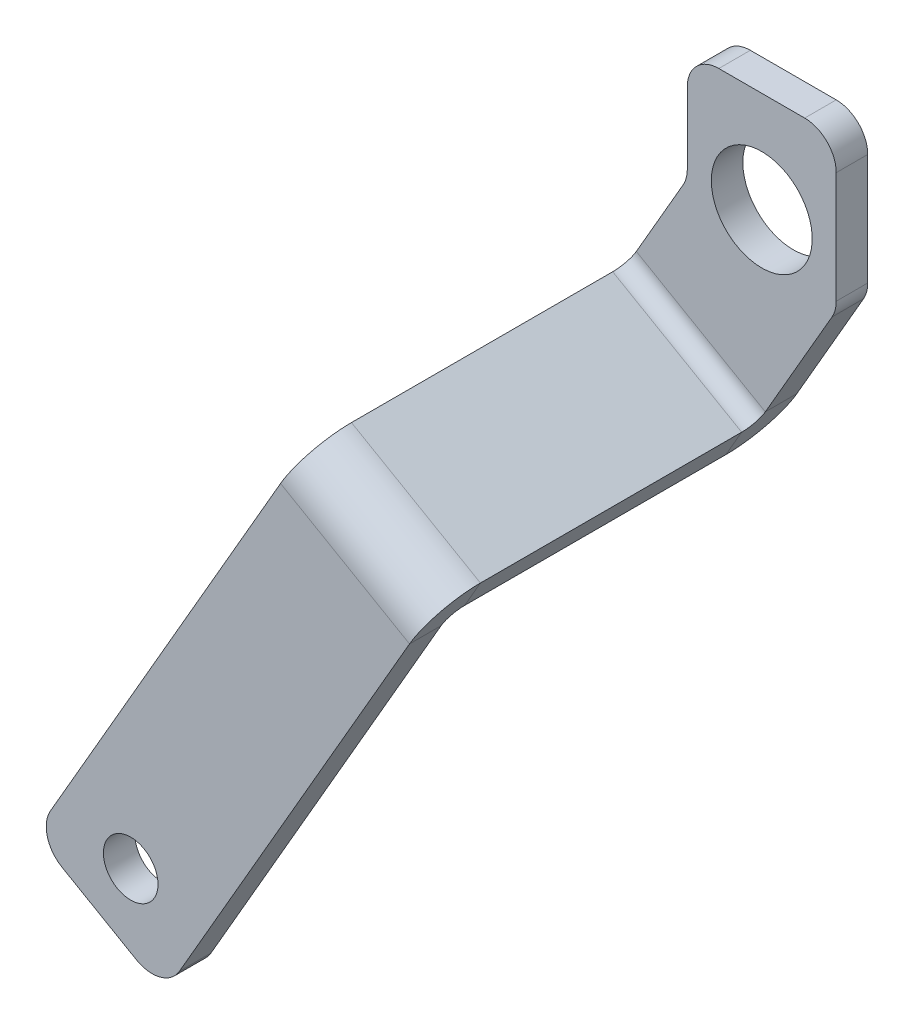
ISO-10303-21;
HEADER;
FILE_DESCRIPTION(('STEP AP214'),'2;1');
FILE_NAME('part.step','',(''),(''),'','','');
FILE_SCHEMA(('AUTOMOTIVE_DESIGN { 1 0 10303 214 1 1 1 1 }'));
ENDSEC;
DATA;
#1=APPLICATION_CONTEXT('core data for automotive mechanical design processes');
#2=APPLICATION_PROTOCOL_DEFINITION('international standard','automotive_design',2000,#1);
#3=PRODUCT_CONTEXT('',#1,'mechanical');
#4=PRODUCT('Part','Part','',(#3));
#5=PRODUCT_RELATED_PRODUCT_CATEGORY('part','',(#4));
#6=PRODUCT_DEFINITION_FORMATION('','',#4);
#7=PRODUCT_DEFINITION_CONTEXT('part definition',#1,'design');
#8=PRODUCT_DEFINITION('design','',#6,#7);
#9=PRODUCT_DEFINITION_SHAPE('','',#8);
#10=(LENGTH_UNIT() NAMED_UNIT(*) SI_UNIT(.MILLI.,.METRE.));
#11=(NAMED_UNIT(*) PLANE_ANGLE_UNIT() SI_UNIT($,.RADIAN.));
#12=(NAMED_UNIT(*) SI_UNIT($,.STERADIAN.) SOLID_ANGLE_UNIT());
#13=UNCERTAINTY_MEASURE_WITH_UNIT(LENGTH_MEASURE(1.E-05),#10,'distance_accuracy_value','');
#14=(GEOMETRIC_REPRESENTATION_CONTEXT(3) GLOBAL_UNCERTAINTY_ASSIGNED_CONTEXT((#13)) GLOBAL_UNIT_ASSIGNED_CONTEXT((#10,
#11,#12)) REPRESENTATION_CONTEXT('',''));
#15=CARTESIAN_POINT('',(0.,0.,0.));
#16=DIRECTION('',(0.,0.,1.));
#17=DIRECTION('',(1.,0.,0.));
#18=AXIS2_PLACEMENT_3D('',#15,#16,#17);
#19=CARTESIAN_POINT('',(-153.02745566794,29.1285594079911,3.175));
#20=DIRECTION('',(0.86602540378444,-0.499999999999997,0.));
#21=DIRECTION('',(0.499999999999997,0.86602540378444,0.));
#22=AXIS2_PLACEMENT_3D('',#19,#20,#21);
#23=PLANE('',#22);
#24=DIRECTION('',(-0.499999999999997,-0.86602540378444,0.));
#25=VECTOR('',#24,1.);
#26=CARTESIAN_POINT('',(-153.02745566794,29.1285594079911,0.));
#27=LINE('',#26,#25);
#28=CARTESIAN_POINT('',(-128.26245566794,72.0227976574344,0.));
#29=VERTEX_POINT('',#28);
#30=CARTESIAN_POINT('',(-151.43995566794,31.8781900650067,0.));
#31=VERTEX_POINT('',#30);
#32=EDGE_CURVE('E316',#29,#31,#27,.T.);
#33=ORIENTED_EDGE('',*,*,#32,.T.);
#34=DIRECTION('',(0.,0.,-1.));
#35=VECTOR('',#34,1.);
#36=CARTESIAN_POINT('',(-151.43995566794,31.8781900650067,3.175));
#37=LINE('',#36,#35);
#38=CARTESIAN_POINT('',(-151.43995566794,31.8781900650067,3.175));
#39=VERTEX_POINT('',#38);
#40=EDGE_CURVE('E110',#31,#39,#37,.F.);
#41=ORIENTED_EDGE('',*,*,#40,.T.);
#42=DIRECTION('',(-0.499999999999997,-0.86602540378444,0.));
#43=VECTOR('',#42,1.);
#44=CARTESIAN_POINT('',(-128.26245566794,72.0227976574345,3.175));
#45=LINE('',#44,#43);
#46=CARTESIAN_POINT('',(-128.26245566794,72.0227976574345,3.175));
#47=VERTEX_POINT('',#46);
#48=EDGE_CURVE('E325',#47,#39,#45,.T.);
#49=ORIENTED_EDGE('',*,*,#48,.F.);
#50=DIRECTION('',(0.,0.,-1.));
#51=VECTOR('',#50,1.);
#52=CARTESIAN_POINT('',(-128.26245566794,72.0227976574345,3.175));
#53=LINE('',#52,#51);
#54=EDGE_CURVE('E335',#47,#29,#53,.T.);
#55=ORIENTED_EDGE('',*,*,#54,.T.);
#56=EDGE_LOOP('',(#33,#41,#49,#55));
#57=FACE_BOUND('',#56,.T.);
#58=ADVANCED_FACE('F87',(#57),#23,.F.);
#59=CARTESIAN_POINT('',(-140.037074611173,21.6285594079912,3.175));
#60=DIRECTION('',(0.499999999999997,0.86602540378444,0.));
#61=DIRECTION('',(-0.86602540378444,0.499999999999997,0.));
#62=AXIS2_PLACEMENT_3D('',#59,#60,#61);
#63=PLANE('',#62);
#64=DIRECTION('',(0.86602540378444,-0.499999999999997,0.));
#65=VECTOR('',#64,1.);
#66=CARTESIAN_POINT('',(-140.037074611173,21.6285594079912,3.175));
#67=LINE('',#66,#65);
#68=CARTESIAN_POINT('',(-150.277825010924,27.5410594079911,3.175));
#69=VERTEX_POINT('',#68);
#70=CARTESIAN_POINT('',(-142.786705268189,23.2160594079912,3.175));
#71=VERTEX_POINT('',#70);
#72=EDGE_CURVE('E327',#69,#71,#67,.T.);
#73=ORIENTED_EDGE('',*,*,#72,.F.);
#74=DIRECTION('',(0.,0.,-1.));
#75=VECTOR('',#74,1.);
#76=CARTESIAN_POINT('',(-150.277825010924,27.5410594079911,3.175));
#77=LINE('',#76,#75);
#78=CARTESIAN_POINT('',(-150.277825010924,27.5410594079911,0.));
#79=VERTEX_POINT('',#78);
#80=EDGE_CURVE('E385',#69,#79,#77,.T.);
#81=ORIENTED_EDGE('',*,*,#80,.T.);
#82=DIRECTION('',(0.86602540378444,-0.499999999999997,0.));
#83=VECTOR('',#82,1.);
#84=CARTESIAN_POINT('',(-140.037074611173,21.6285594079912,0.));
#85=LINE('',#84,#83);
#86=CARTESIAN_POINT('',(-142.786705268189,23.2160594079912,0.));
#87=VERTEX_POINT('',#86);
#88=EDGE_CURVE('E337',#79,#87,#85,.T.);
#89=ORIENTED_EDGE('',*,*,#88,.T.);
#90=DIRECTION('',(0.,0.,-1.));
#91=VECTOR('',#90,1.);
#92=CARTESIAN_POINT('',(-142.786705268189,23.2160594079912,3.175));
#93=LINE('',#92,#91);
#94=EDGE_CURVE('E383',#87,#71,#93,.F.);
#95=ORIENTED_EDGE('',*,*,#94,.T.);
#96=EDGE_LOOP('',(#73,#81,#89,#95));
#97=FACE_BOUND('',#96,.T.);
#98=ADVANCED_FACE('F453',(#97),#63,.F.);
#99=CARTESIAN_POINT('',(-136.862074611173,27.1278207220224,3.175));
#100=DIRECTION('',(-0.86602540378444,0.499999999999997,0.));
#101=DIRECTION('',(-0.499999999999997,-0.86602540378444,0.));
#102=AXIS2_PLACEMENT_3D('',#99,#100,#101);
#103=PLANE('',#102);
#104=DIRECTION('',(0.499999999999997,0.86602540378444,0.));
#105=VECTOR('',#104,1.);
#106=CARTESIAN_POINT('',(-136.862074611173,27.1278207220224,3.175));
#107=LINE('',#106,#105);
#108=CARTESIAN_POINT('',(-138.449574611173,24.3781900650068,3.175));
#109=VERTEX_POINT('',#108);
#110=CARTESIAN_POINT('',(-115.272074611173,64.5227976574345,3.17500000000002));
#111=VERTEX_POINT('',#110);
#112=EDGE_CURVE('E330',#109,#111,#107,.T.);
#113=ORIENTED_EDGE('',*,*,#112,.F.);
#114=DIRECTION('',(0.,0.,-1.));
#115=VECTOR('',#114,1.);
#116=CARTESIAN_POINT('',(-138.449574611173,24.3781900650068,3.175));
#117=LINE('',#116,#115);
#118=CARTESIAN_POINT('',(-138.449574611173,24.3781900650068,0.));
#119=VERTEX_POINT('',#118);
#120=EDGE_CURVE('E396',#109,#119,#117,.T.);
#121=ORIENTED_EDGE('',*,*,#120,.T.);
#122=DIRECTION('',(0.499999999999997,0.86602540378444,0.));
#123=VECTOR('',#122,1.);
#124=CARTESIAN_POINT('',(-136.862074611173,27.1278207220224,0.));
#125=LINE('',#124,#123);
#126=CARTESIAN_POINT('',(-115.272074611173,64.5227976574345,0.));
#127=VERTEX_POINT('',#126);
#128=EDGE_CURVE('E340',#119,#127,#125,.T.);
#129=ORIENTED_EDGE('',*,*,#128,.T.);
#130=DIRECTION('',(0.,0.,-1.));
#131=VECTOR('',#130,1.);
#132=CARTESIAN_POINT('',(-115.272074611173,64.5227976574345,3.175));
#133=LINE('',#132,#131);
#134=EDGE_CURVE('E345',#111,#127,#133,.T.);
#135=ORIENTED_EDGE('',*,*,#134,.F.);
#136=EDGE_LOOP('',(#113,#121,#129,#135));
#137=FACE_BOUND('',#136,.T.);
#138=ADVANCED_FACE('F459',(#137),#103,.F.);
#139=CARTESIAN_POINT('',(0.,0.,3.175));
#140=DIRECTION('',(0.,0.,-1.));
#141=DIRECTION('',(-1.,0.,0.));
#142=AXIS2_PLACEMENT_3D('',#139,#140,#141);
#143=PLANE('',#142);
#144=CARTESIAN_POINT('',(-143.357265139557,30.8778207220224,3.175));
#145=DIRECTION('',(0.,0.,1.));
#146=DIRECTION('',(1.,0.,0.));
#147=AXIS2_PLACEMENT_3D('',#144,#145,#146);
#148=CIRCLE('',#147,2.75);
#149=CARTESIAN_POINT('',(-140.607265139557,30.8778207220224,3.175));
#150=VERTEX_POINT('',#149);
#151=EDGE_CURVE('E353',#150,#150,#148,.T.);
#152=ORIENTED_EDGE('',*,*,#151,.F.);
#153=EDGE_LOOP('',(#152));
#154=FACE_BOUND('',#153,.T.);
#155=ORIENTED_EDGE('',*,*,#48,.T.);
#156=CARTESIAN_POINT('',(-148.690325010924,30.2906900650067,3.175));
#157=DIRECTION('',(0.,0.,-1.));
#158=DIRECTION('',(-1.,0.,0.));
#159=AXIS2_PLACEMENT_3D('',#156,#157,#158);
#160=CIRCLE('',#159,3.175);
#161=EDGE_CURVE('E394',#39,#69,#160,.F.);
#162=ORIENTED_EDGE('',*,*,#161,.T.);
#163=ORIENTED_EDGE('',*,*,#72,.T.);
#164=CARTESIAN_POINT('',(-141.199205268189,25.9656900650068,3.175));
#165=DIRECTION('',(0.,0.,-1.));
#166=DIRECTION('',(-1.,0.,0.));
#167=AXIS2_PLACEMENT_3D('',#164,#165,#166);
#168=CIRCLE('',#167,3.175);
#169=EDGE_CURVE('E102',#71,#109,#168,.F.);
#170=ORIENTED_EDGE('',*,*,#169,.T.);
#171=ORIENTED_EDGE('',*,*,#112,.T.);
#172=DIRECTION('',(-0.86602540378444,0.499999999999997,0.));
#173=VECTOR('',#172,1.);
#174=CARTESIAN_POINT('',(-115.272074611173,64.5227976574345,3.175));
#175=LINE('',#174,#173);
#176=EDGE_CURVE('E332',#111,#47,#175,.T.);
#177=ORIENTED_EDGE('',*,*,#176,.T.);
#178=EDGE_LOOP('',(#155,#162,#163,#170,#171,#177));
#179=FACE_BOUND('',#178,.T.);
#180=ADVANCED_FACE('F520',(#154,#179),#143,.F.);
#181=CARTESIAN_POINT('',(0.,0.,0.));
#182=DIRECTION('',(0.,0.,-1.));
#183=DIRECTION('',(-1.,0.,0.));
#184=AXIS2_PLACEMENT_3D('',#181,#182,#183);
#185=PLANE('',#184);
#186=CARTESIAN_POINT('',(-143.357265139557,30.8778207220224,0.));
#187=DIRECTION('',(0.,0.,-1.));
#188=DIRECTION('',(-1.,0.,0.));
#189=AXIS2_PLACEMENT_3D('',#186,#187,#188);
#190=CIRCLE('',#189,2.75);
#191=CARTESIAN_POINT('',(-146.107265139557,30.8778207220224,0.));
#192=VERTEX_POINT('',#191);
#193=EDGE_CURVE('E349',#192,#192,#190,.T.);
#194=ORIENTED_EDGE('',*,*,#193,.F.);
#195=EDGE_LOOP('',(#194));
#196=FACE_BOUND('',#195,.T.);
#197=ORIENTED_EDGE('',*,*,#88,.F.);
#198=CARTESIAN_POINT('',(-148.690325010924,30.2906900650067,0.));
#199=DIRECTION('',(0.,0.,-1.));
#200=DIRECTION('',(-1.,0.,0.));
#201=AXIS2_PLACEMENT_3D('',#198,#199,#200);
#202=CIRCLE('',#201,3.175);
#203=EDGE_CURVE('E390',#79,#31,#202,.T.);
#204=ORIENTED_EDGE('',*,*,#203,.T.);
#205=ORIENTED_EDGE('',*,*,#32,.F.);
#206=DIRECTION('',(-0.86602540378444,0.499999999999997,0.));
#207=VECTOR('',#206,1.);
#208=CARTESIAN_POINT('',(-115.272074611173,64.5227976574345,0.));
#209=LINE('',#208,#207);
#210=EDGE_CURVE('E328',#127,#29,#209,.T.);
#211=ORIENTED_EDGE('',*,*,#210,.F.);
#212=ORIENTED_EDGE('',*,*,#128,.F.);
#213=CARTESIAN_POINT('',(-141.199205268189,25.9656900650068,0.));
#214=DIRECTION('',(0.,0.,-1.));
#215=DIRECTION('',(-1.,0.,0.));
#216=AXIS2_PLACEMENT_3D('',#213,#214,#215);
#217=CIRCLE('',#216,3.175);
#218=EDGE_CURVE('E388',#119,#87,#217,.T.);
#219=ORIENTED_EDGE('',*,*,#218,.T.);
#220=EDGE_LOOP('',(#197,#204,#205,#211,#212,#219));
#221=FACE_BOUND('',#220,.T.);
#222=ADVANCED_FACE('F532',(#196,#221),#185,.T.);
#223=CARTESIAN_POINT('',(-128.26245566794,72.0227976574344,-1.5875));
#224=DIRECTION('',(-0.866025403784441,0.499999999999996,0.));
#225=DIRECTION('',(-0.499999999999996,-0.866025403784441,0.));
#226=AXIS2_PLACEMENT_3D('',#223,#224,#225);
#227=PLANE('',#226);
#228=DIRECTION('',(-0.499999999999997,-0.86602540378444,0.));
#229=VECTOR('',#228,1.);
#230=CARTESIAN_POINT('',(-125.88120566794,76.1472436429578,-1.58749999999998));
#231=LINE('',#230,#229);
#232=CARTESIAN_POINT('',(-127.46870566794,73.3976129859422,-1.58749999999999));
#233=VERTEX_POINT('',#232);
#234=CARTESIAN_POINT('',(-125.88120566794,76.1472436429578,-1.58749999999998));
#235=VERTEX_POINT('',#234);
#236=EDGE_CURVE('E279',#233,#235,#231,.F.);
#237=ORIENTED_EDGE('',*,*,#236,.F.);
#238=CARTESIAN_POINT('',(-128.26245566794,72.0227976574344,-1.5875));
#239=DIRECTION('',(0.866025403784441,-0.499999999999996,0.));
#240=DIRECTION('',(0.499999999999996,0.866025403784441,0.));
#241=AXIS2_PLACEMENT_3D('',#238,#239,#240);
#242=CIRCLE('',#241,1.58750000000003);
#243=EDGE_CURVE('E320',#29,#233,#242,.F.);
#244=ORIENTED_EDGE('',*,*,#243,.F.);
#245=ORIENTED_EDGE('',*,*,#54,.F.);
#246=CARTESIAN_POINT('',(-128.26245566794,72.0227976574344,-1.5875));
#247=DIRECTION('',(0.866025403784441,-0.499999999999996,0.));
#248=DIRECTION('',(0.499999999999996,0.866025403784441,0.));
#249=AXIS2_PLACEMENT_3D('',#246,#247,#248);
#250=CIRCLE('',#249,4.76250000000003);
#251=EDGE_CURVE('E313',#47,#235,#250,.F.);
#252=ORIENTED_EDGE('',*,*,#251,.T.);
#253=EDGE_LOOP('',(#237,#244,#245,#252));
#254=FACE_BOUND('',#253,.T.);
#255=ADVANCED_FACE('F500',(#254),#227,.T.);
#256=CARTESIAN_POINT('',(-115.272074611173,64.5227976574345,-1.5875));
#257=DIRECTION('',(-0.866025403784441,0.499999999999996,0.));
#258=DIRECTION('',(-0.499999999999996,-0.866025403784441,0.));
#259=AXIS2_PLACEMENT_3D('',#256,#257,#258);
#260=PLANE('',#259);
#261=CARTESIAN_POINT('',(-115.272074611173,64.5227976574345,-1.5875));
#262=DIRECTION('',(0.866025403784441,-0.499999999999996,0.));
#263=DIRECTION('',(0.499999999999996,0.866025403784441,0.));
#264=AXIS2_PLACEMENT_3D('',#261,#262,#263);
#265=CIRCLE('',#264,1.58750000000003);
#266=CARTESIAN_POINT('',(-114.478324611173,65.8976129859423,-1.5875));
#267=VERTEX_POINT('',#266);
#268=EDGE_CURVE('E287',#267,#127,#265,.T.);
#269=ORIENTED_EDGE('',*,*,#268,.F.);
#270=DIRECTION('',(-0.499999999999997,-0.86602540378444,0.));
#271=VECTOR('',#270,1.);
#272=CARTESIAN_POINT('',(-114.478324611173,65.8976129859423,-1.5875));
#273=LINE('',#272,#271);
#274=CARTESIAN_POINT('',(-112.890824611173,68.6472436429579,-1.58749999999999));
#275=VERTEX_POINT('',#274);
#276=EDGE_CURVE('E306',#267,#275,#273,.F.);
#277=ORIENTED_EDGE('',*,*,#276,.T.);
#278=CARTESIAN_POINT('',(-115.272074611173,64.5227976574345,-1.5875));
#279=DIRECTION('',(0.866025403784441,-0.499999999999996,0.));
#280=DIRECTION('',(0.499999999999996,0.866025403784441,0.));
#281=AXIS2_PLACEMENT_3D('',#278,#279,#280);
#282=CIRCLE('',#281,4.76250000000003);
#283=EDGE_CURVE('E317',#275,#111,#282,.T.);
#284=ORIENTED_EDGE('',*,*,#283,.T.);
#285=ORIENTED_EDGE('',*,*,#134,.T.);
#286=EDGE_LOOP('',(#269,#277,#284,#285));
#287=FACE_BOUND('',#286,.T.);
#288=ADVANCED_FACE('F515',(#287),#260,.F.);
#289=CARTESIAN_POINT('',(-115.272074611173,64.5227976574345,-1.5875));
#290=DIRECTION('',(0.866025403784441,-0.499999999999996,0.));
#291=DIRECTION('',(0.499999999999996,0.866025403784441,0.));
#292=AXIS2_PLACEMENT_3D('',#289,#290,#291);
#293=CYLINDRICAL_SURFACE('',#292,4.76250000000003);
#294=ORIENTED_EDGE('',*,*,#176,.F.);
#295=ORIENTED_EDGE('',*,*,#283,.F.);
#296=DIRECTION('',(0.86602540378444,-0.499999999999997,0.));
#297=VECTOR('',#296,1.);
#298=CARTESIAN_POINT('',(-125.88120566794,76.1472436429576,-1.58749999999998));
#299=LINE('',#298,#297);
#300=EDGE_CURVE('E304',#275,#235,#299,.F.);
#301=ORIENTED_EDGE('',*,*,#300,.T.);
#302=ORIENTED_EDGE('',*,*,#251,.F.);
#303=EDGE_LOOP('',(#294,#295,#301,#302));
#304=FACE_BOUND('',#303,.T.);
#305=ADVANCED_FACE('F519',(#304),#293,.T.);
#306=CARTESIAN_POINT('',(-115.272074611173,64.5227976574345,-1.5875));
#307=DIRECTION('',(0.866025403784441,-0.499999999999996,0.));
#308=DIRECTION('',(0.499999999999996,0.866025403784441,0.));
#309=AXIS2_PLACEMENT_3D('',#306,#307,#308);
#310=CYLINDRICAL_SURFACE('',#309,1.58750000000003);
#311=ORIENTED_EDGE('',*,*,#210,.T.);
#312=ORIENTED_EDGE('',*,*,#243,.T.);
#313=DIRECTION('',(0.86602540378444,-0.499999999999997,0.));
#314=VECTOR('',#313,1.);
#315=CARTESIAN_POINT('',(-127.46870566794,73.397612985942,-1.58749999999999));
#316=LINE('',#315,#314);
#317=EDGE_CURVE('E309',#233,#267,#316,.T.);
#318=ORIENTED_EDGE('',*,*,#317,.T.);
#319=ORIENTED_EDGE('',*,*,#268,.T.);
#320=EDGE_LOOP('',(#311,#312,#318,#319));
#321=FACE_BOUND('',#320,.T.);
#322=ADVANCED_FACE('F505',(#321),#310,.F.);
#323=CARTESIAN_POINT('',(-112.890824611173,68.6472436429576,-27.899995));
#324=DIRECTION('',(-0.86602540378444,0.499999999999997,0.));
#325=DIRECTION('',(-0.499999999999997,-0.86602540378444,0.));
#326=AXIS2_PLACEMENT_3D('',#323,#324,#325);
#327=PLANE('',#326);
#328=ORIENTED_EDGE('',*,*,#276,.F.);
#329=DIRECTION('',(0.,0.,1.));
#330=VECTOR('',#329,1.);
#331=CARTESIAN_POINT('',(-114.478324611173,65.897612985942,-27.899995));
#332=LINE('',#331,#330);
#333=CARTESIAN_POINT('',(-114.478324611173,65.897612985942,-27.899995));
#334=VERTEX_POINT('',#333);
#335=EDGE_CURVE('E302',#267,#334,#332,.F.);
#336=ORIENTED_EDGE('',*,*,#335,.T.);
#337=DIRECTION('',(-0.499999999999997,-0.86602540378444,0.));
#338=VECTOR('',#337,1.);
#339=CARTESIAN_POINT('',(-112.890824611173,68.6472436429576,-27.899995));
#340=LINE('',#339,#338);
#341=CARTESIAN_POINT('',(-112.890824611173,68.6472436429576,-27.899995));
#342=VERTEX_POINT('',#341);
#343=EDGE_CURVE('E284',#342,#334,#340,.T.);
#344=ORIENTED_EDGE('',*,*,#343,.F.);
#345=DIRECTION('',(0.,0.,-1.));
#346=VECTOR('',#345,1.);
#347=CARTESIAN_POINT('',(-112.890824611173,68.6472436429579,-3.82332133157478E-12));
#348=LINE('',#347,#346);
#349=EDGE_CURVE('E296',#275,#342,#348,.T.);
#350=ORIENTED_EDGE('',*,*,#349,.F.);
#351=EDGE_LOOP('',(#328,#336,#344,#350));
#352=FACE_BOUND('',#351,.T.);
#353=ADVANCED_FACE('F513',(#352),#327,.F.);
#354=CARTESIAN_POINT('',(-125.88120566794,76.1472436429578,0.));
#355=DIRECTION('',(0.86602540378444,-0.499999999999997,0.));
#356=DIRECTION('',(0.499999999999997,0.86602540378444,0.));
#357=AXIS2_PLACEMENT_3D('',#354,#355,#356);
#358=PLANE('',#357);
#359=ORIENTED_EDGE('',*,*,#236,.T.);
#360=DIRECTION('',(0.,0.,1.));
#361=VECTOR('',#360,1.);
#362=CARTESIAN_POINT('',(-125.88120566794,76.1472436429578,-4.421356006099E-12));
#363=LINE('',#362,#361);
#364=CARTESIAN_POINT('',(-125.881205667939,76.1472436429575,-27.899995));
#365=VERTEX_POINT('',#364);
#366=EDGE_CURVE('E291',#365,#235,#363,.T.);
#367=ORIENTED_EDGE('',*,*,#366,.F.);
#368=DIRECTION('',(-0.499999999999997,-0.86602540378444,0.));
#369=VECTOR('',#368,1.);
#370=CARTESIAN_POINT('',(-125.881205667939,76.1472436429575,-27.899995));
#371=LINE('',#370,#369);
#372=CARTESIAN_POINT('',(-127.468705667939,73.3976129859419,-27.899995));
#373=VERTEX_POINT('',#372);
#374=EDGE_CURVE('E288',#365,#373,#371,.T.);
#375=ORIENTED_EDGE('',*,*,#374,.T.);
#376=DIRECTION('',(0.,0.,-1.));
#377=VECTOR('',#376,1.);
#378=CARTESIAN_POINT('',(-127.46870566794,73.3976129859422,0.));
#379=LINE('',#378,#377);
#380=EDGE_CURVE('E298',#373,#233,#379,.F.);
#381=ORIENTED_EDGE('',*,*,#380,.T.);
#382=EDGE_LOOP('',(#359,#367,#375,#381));
#383=FACE_BOUND('',#382,.T.);
#384=ADVANCED_FACE('F497',(#383),#358,.F.);
#385=CARTESIAN_POINT('',(1.50242229449749,2.60227174849389,0.));
#386=DIRECTION('',(-0.499999999999998,-0.86602540378444,0.));
#387=DIRECTION('',(0.86602540378444,-0.499999999999997,0.));
#388=AXIS2_PLACEMENT_3D('',#385,#386,#387);
#389=PLANE('',#388);
#390=ORIENTED_EDGE('',*,*,#300,.F.);
#391=ORIENTED_EDGE('',*,*,#349,.T.);
#392=DIRECTION('',(-0.86602540378444,0.499999999999997,0.));
#393=VECTOR('',#392,1.);
#394=CARTESIAN_POINT('',(1.50242229449754,2.60227174849397,-27.899995));
#395=LINE('',#394,#393);
#396=EDGE_CURVE('E294',#342,#365,#395,.T.);
#397=ORIENTED_EDGE('',*,*,#396,.T.);
#398=ORIENTED_EDGE('',*,*,#366,.T.);
#399=EDGE_LOOP('',(#390,#391,#397,#398));
#400=FACE_BOUND('',#399,.T.);
#401=ADVANCED_FACE('F493',(#400),#389,.F.);
#402=CARTESIAN_POINT('',(-0.0850777055024985,-0.147358908521709,0.));
#403=DIRECTION('',(-0.499999999999998,-0.86602540378444,0.));
#404=DIRECTION('',(0.86602540378444,-0.499999999999997,0.));
#405=AXIS2_PLACEMENT_3D('',#402,#403,#404);
#406=PLANE('',#405);
#407=ORIENTED_EDGE('',*,*,#335,.F.);
#408=ORIENTED_EDGE('',*,*,#317,.F.);
#409=ORIENTED_EDGE('',*,*,#380,.F.);
#410=DIRECTION('',(0.86602540378444,-0.499999999999997,0.));
#411=VECTOR('',#410,1.);
#412=CARTESIAN_POINT('',(-127.468705667939,73.3976129859419,-27.899995));
#413=LINE('',#412,#411);
#414=EDGE_CURVE('E235',#334,#373,#413,.F.);
#415=ORIENTED_EDGE('',*,*,#414,.F.);
#416=EDGE_LOOP('',(#407,#408,#409,#415));
#417=FACE_BOUND('',#416,.T.);
#418=ADVANCED_FACE('F510',(#417),#406,.T.);
#419=CARTESIAN_POINT('',(-112.097074611173,70.0220589714654,-27.899995));
#420=DIRECTION('',(0.86602540378444,-0.499999999999998,0.));
#421=DIRECTION('',(0.499999999999998,0.86602540378444,0.));
#422=AXIS2_PLACEMENT_3D('',#419,#420,#421);
#423=PLANE('',#422);
#424=DIRECTION('',(0.,0.,1.));
#425=VECTOR('',#424,1.);
#426=CARTESIAN_POINT('',(-112.097074611173,70.0220589714654,-32.662495));
#427=LINE('',#426,#425);
#428=CARTESIAN_POINT('',(-112.097074611173,70.0220589714654,-29.487495));
#429=VERTEX_POINT('',#428);
#430=CARTESIAN_POINT('',(-112.097074611173,70.0220589714654,-32.662495));
#431=VERTEX_POINT('',#430);
#432=EDGE_CURVE('E275',#429,#431,#427,.F.);
#433=ORIENTED_EDGE('',*,*,#432,.F.);
#434=CARTESIAN_POINT('',(-112.097074611173,70.0220589714654,-27.899995));
#435=DIRECTION('',(-0.86602540378444,0.499999999999998,0.));
#436=DIRECTION('',(-0.499999999999998,-0.86602540378444,0.));
#437=AXIS2_PLACEMENT_3D('',#434,#435,#436);
#438=CIRCLE('',#437,1.5875);
#439=EDGE_CURVE('E239',#342,#429,#438,.F.);
#440=ORIENTED_EDGE('',*,*,#439,.F.);
#441=ORIENTED_EDGE('',*,*,#343,.T.);
#442=CARTESIAN_POINT('',(-112.097074611173,70.0220589714654,-27.899995));
#443=DIRECTION('',(-0.86602540378444,0.499999999999998,0.));
#444=DIRECTION('',(-0.499999999999998,-0.86602540378444,0.));
#445=AXIS2_PLACEMENT_3D('',#442,#443,#444);
#446=CIRCLE('',#445,4.7625);
#447=EDGE_CURVE('E238',#334,#431,#446,.F.);
#448=ORIENTED_EDGE('',*,*,#447,.T.);
#449=EDGE_LOOP('',(#433,#440,#441,#448));
#450=FACE_BOUND('',#449,.T.);
#451=ADVANCED_FACE('F486',(#450),#423,.T.);
#452=CARTESIAN_POINT('',(-125.087455667939,77.5220589714653,-27.899995));
#453=DIRECTION('',(0.86602540378444,-0.499999999999998,0.));
#454=DIRECTION('',(0.499999999999998,0.86602540378444,0.));
#455=AXIS2_PLACEMENT_3D('',#452,#453,#454);
#456=PLANE('',#455);
#457=CARTESIAN_POINT('',(-125.087455667939,77.5220589714653,-27.899995));
#458=DIRECTION('',(-0.86602540378444,0.499999999999998,0.));
#459=DIRECTION('',(-0.499999999999998,-0.86602540378444,0.));
#460=AXIS2_PLACEMENT_3D('',#457,#458,#459);
#461=CIRCLE('',#460,1.5875);
#462=CARTESIAN_POINT('',(-125.087455667939,77.5220589714653,-29.487495));
#463=VERTEX_POINT('',#462);
#464=EDGE_CURVE('E246',#463,#365,#461,.T.);
#465=ORIENTED_EDGE('',*,*,#464,.F.);
#466=DIRECTION('',(0.,0.,1.));
#467=VECTOR('',#466,1.);
#468=CARTESIAN_POINT('',(-125.087455667939,77.5220589714653,-29.487495));
#469=LINE('',#468,#467);
#470=CARTESIAN_POINT('',(-125.087455667939,77.5220589714653,-32.662495));
#471=VERTEX_POINT('',#470);
#472=EDGE_CURVE('E243',#463,#471,#469,.F.);
#473=ORIENTED_EDGE('',*,*,#472,.T.);
#474=CARTESIAN_POINT('',(-125.087455667939,77.5220589714653,-27.899995));
#475=DIRECTION('',(-0.86602540378444,0.499999999999998,0.));
#476=DIRECTION('',(-0.499999999999998,-0.86602540378444,0.));
#477=AXIS2_PLACEMENT_3D('',#474,#475,#476);
#478=CIRCLE('',#477,4.7625);
#479=EDGE_CURVE('E227',#471,#373,#478,.T.);
#480=ORIENTED_EDGE('',*,*,#479,.T.);
#481=ORIENTED_EDGE('',*,*,#374,.F.);
#482=EDGE_LOOP('',(#465,#473,#480,#481));
#483=FACE_BOUND('',#482,.T.);
#484=ADVANCED_FACE('F244',(#483),#456,.F.);
#485=CARTESIAN_POINT('',(-125.087455667939,77.5220589714653,-27.899995));
#486=DIRECTION('',(-0.86602540378444,0.499999999999998,0.));
#487=DIRECTION('',(0.,0.,-1.));
#488=AXIS2_PLACEMENT_3D('',#485,#486,#487);
#489=CYLINDRICAL_SURFACE('',#488,4.7625);
#490=ORIENTED_EDGE('',*,*,#414,.T.);
#491=ORIENTED_EDGE('',*,*,#479,.F.);
#492=DIRECTION('',(-0.866025403784442,0.499999999999995,0.));
#493=VECTOR('',#492,1.);
#494=CARTESIAN_POINT('',(-112.097074611173,70.0220589714654,-32.662495));
#495=LINE('',#494,#493);
#496=EDGE_CURVE('E232',#471,#431,#495,.F.);
#497=ORIENTED_EDGE('',*,*,#496,.T.);
#498=ORIENTED_EDGE('',*,*,#447,.F.);
#499=EDGE_LOOP('',(#490,#491,#497,#498));
#500=FACE_BOUND('',#499,.T.);
#501=ADVANCED_FACE('F229',(#500),#489,.T.);
#502=CARTESIAN_POINT('',(-125.087455667939,77.5220589714653,-27.899995));
#503=DIRECTION('',(-0.86602540378444,0.499999999999998,0.));
#504=DIRECTION('',(0.,0.,-1.));
#505=AXIS2_PLACEMENT_3D('',#502,#503,#504);
#506=CYLINDRICAL_SURFACE('',#505,1.5875);
#507=ORIENTED_EDGE('',*,*,#396,.F.);
#508=ORIENTED_EDGE('',*,*,#439,.T.);
#509=DIRECTION('',(-0.866025403784442,0.499999999999995,0.));
#510=VECTOR('',#509,1.);
#511=CARTESIAN_POINT('',(-112.097074611173,70.0220589714654,-29.487495));
#512=LINE('',#511,#510);
#513=EDGE_CURVE('E251',#429,#463,#512,.T.);
#514=ORIENTED_EDGE('',*,*,#513,.T.);
#515=ORIENTED_EDGE('',*,*,#464,.T.);
#516=EDGE_LOOP('',(#507,#508,#514,#515));
#517=FACE_BOUND('',#516,.T.);
#518=ADVANCED_FACE('F489',(#517),#506,.F.);
#519=CARTESIAN_POINT('',(-122.706205667939,81.6465049569887,-32.662495));
#520=DIRECTION('',(0.866025403784441,-0.499999999999996,0.));
#521=DIRECTION('',(0.499999999999996,0.866025403784441,0.));
#522=AXIS2_PLACEMENT_3D('',#519,#520,#521);
#523=PLANE('',#522);
#524=DIRECTION('',(-0.499999999999996,-0.866025403784441,0.));
#525=VECTOR('',#524,1.);
#526=CARTESIAN_POINT('',(-122.706205667939,81.6465049569887,-29.487495));
#527=LINE('',#526,#525);
#528=CARTESIAN_POINT('',(-120.378693954157,85.6778735004711,-29.487495));
#529=VERTEX_POINT('',#528);
#530=EDGE_CURVE('E261',#463,#529,#527,.F.);
#531=ORIENTED_EDGE('',*,*,#530,.T.);
#532=DIRECTION('',(0.,0.,-1.));
#533=VECTOR('',#532,1.);
#534=CARTESIAN_POINT('',(-120.378693954157,85.6778735004711,-32.662495));
#535=LINE('',#534,#533);
#536=CARTESIAN_POINT('',(-120.378693954157,85.6778735004711,-32.662495));
#537=VERTEX_POINT('',#536);
#538=EDGE_CURVE('E266',#529,#537,#535,.T.);
#539=ORIENTED_EDGE('',*,*,#538,.T.);
#540=DIRECTION('',(0.499999999999996,0.866025403784441,0.));
#541=VECTOR('',#540,1.);
#542=CARTESIAN_POINT('',(-127.383627962437,73.5449718944632,-32.662495));
#543=LINE('',#542,#541);
#544=EDGE_CURVE('E258',#471,#537,#543,.T.);
#545=ORIENTED_EDGE('',*,*,#544,.F.);
#546=ORIENTED_EDGE('',*,*,#472,.F.);
#547=EDGE_LOOP('',(#531,#539,#545,#546));
#548=FACE_BOUND('',#547,.T.);
#549=ADVANCED_FACE('F264',(#548),#523,.F.);
#550=CARTESIAN_POINT('',(-112.890824611173,68.6472436429576,-32.662495));
#551=DIRECTION('',(-0.866025403784443,0.499999999999992,0.));
#552=DIRECTION('',(-0.499999999999992,-0.866025403784443,0.));
#553=AXIS2_PLACEMENT_3D('',#550,#551,#552);
#554=PLANE('',#553);
#555=DIRECTION('',(-0.499999999999992,-0.866025403784443,0.));
#556=VECTOR('',#555,1.);
#557=CARTESIAN_POINT('',(-114.393246905671,66.0449718944629,-32.662495));
#558=LINE('',#557,#556);
#559=CARTESIAN_POINT('',(-105.378693954157,81.6586356140045,-32.662495));
#560=VERTEX_POINT('',#559);
#561=EDGE_CURVE('E260',#560,#431,#558,.T.);
#562=ORIENTED_EDGE('',*,*,#561,.F.);
#563=DIRECTION('',(0.,0.,-1.));
#564=VECTOR('',#563,1.);
#565=CARTESIAN_POINT('',(-105.378693954157,81.6586356140045,-29.487495));
#566=LINE('',#565,#564);
#567=CARTESIAN_POINT('',(-105.378693954157,81.6586356140045,-29.487495));
#568=VERTEX_POINT('',#567);
#569=EDGE_CURVE('E364',#560,#568,#566,.F.);
#570=ORIENTED_EDGE('',*,*,#569,.T.);
#571=DIRECTION('',(0.499999999999992,0.866025403784443,0.));
#572=VECTOR('',#571,1.);
#573=CARTESIAN_POINT('',(-112.890824611173,68.6472436429576,-29.487495));
#574=LINE('',#573,#572);
#575=EDGE_CURVE('E267',#568,#429,#574,.F.);
#576=ORIENTED_EDGE('',*,*,#575,.T.);
#577=ORIENTED_EDGE('',*,*,#432,.T.);
#578=EDGE_LOOP('',(#562,#570,#576,#577));
#579=FACE_BOUND('',#578,.T.);
#580=ADVANCED_FACE('F482',(#579),#554,.F.);
#581=CARTESIAN_POINT('',(0.,0.,-32.662495));
#582=DIRECTION('',(0.,0.,1.));
#583=DIRECTION('',(1.,0.,0.));
#584=AXIS2_PLACEMENT_3D('',#581,#582,#583);
#585=PLANE('',#584);
#586=DIRECTION('',(0.,-1.,0.));
#587=VECTOR('',#586,1.);
#588=CARTESIAN_POINT('',(-104.953324611173,82.3953969280356,-32.662495));
#589=LINE('',#588,#587);
#590=CARTESIAN_POINT('',(-104.953324611173,94.4603969280356,-32.662495));
#591=VERTEX_POINT('',#590);
#592=CARTESIAN_POINT('',(-104.953324611173,83.2461356140045,-32.662495));
#593=VERTEX_POINT('',#592);
#594=EDGE_CURVE('E422',#591,#593,#589,.T.);
#595=ORIENTED_EDGE('',*,*,#594,.T.);
#596=CARTESIAN_POINT('',(-108.128324611173,83.2461356140045,-32.662495));
#597=DIRECTION('',(0.,0.,1.));
#598=DIRECTION('',(1.,0.,0.));
#599=AXIS2_PLACEMENT_3D('',#596,#597,#598);
#600=CIRCLE('',#599,3.175);
#601=EDGE_CURVE('E362',#593,#560,#600,.F.);
#602=ORIENTED_EDGE('',*,*,#601,.T.);
#603=ORIENTED_EDGE('',*,*,#561,.T.);
#604=ORIENTED_EDGE('',*,*,#496,.F.);
#605=ORIENTED_EDGE('',*,*,#544,.T.);
#606=CARTESIAN_POINT('',(-123.128324611173,87.2653735004711,-32.662495));
#607=DIRECTION('',(0.,0.,1.));
#608=DIRECTION('',(1.,0.,0.));
#609=AXIS2_PLACEMENT_3D('',#606,#607,#608);
#610=CIRCLE('',#609,3.175);
#611=CARTESIAN_POINT('',(-119.953324611173,87.2653735004711,-32.662495));
#612=VERTEX_POINT('',#611);
#613=EDGE_CURVE('E95',#537,#612,#610,.T.);
#614=ORIENTED_EDGE('',*,*,#613,.T.);
#615=DIRECTION('',(0.,1.,0.));
#616=VECTOR('',#615,1.);
#617=CARTESIAN_POINT('',(-119.953324611173,97.6353969280356,-32.662495));
#618=LINE('',#617,#616);
#619=CARTESIAN_POINT('',(-119.953324611173,94.4603969280356,-32.662495));
#620=VERTEX_POINT('',#619);
#621=EDGE_CURVE('E400',#612,#620,#618,.T.);
#622=ORIENTED_EDGE('',*,*,#621,.T.);
#623=CARTESIAN_POINT('',(-116.778324611173,94.4603969280356,-32.662495));
#624=DIRECTION('',(0.,0.,1.));
#625=DIRECTION('',(1.,0.,0.));
#626=AXIS2_PLACEMENT_3D('',#623,#624,#625);
#627=CIRCLE('',#626,3.175);
#628=CARTESIAN_POINT('',(-116.778324611173,97.6353969280356,-32.662495));
#629=VERTEX_POINT('',#628);
#630=EDGE_CURVE('E360',#620,#629,#627,.F.);
#631=ORIENTED_EDGE('',*,*,#630,.T.);
#632=DIRECTION('',(1.,0.,0.));
#633=VECTOR('',#632,1.);
#634=CARTESIAN_POINT('',(-119.953324611173,97.6353969280356,-32.662495));
#635=LINE('',#634,#633);
#636=CARTESIAN_POINT('',(-108.128324611173,97.6353969280356,-32.662495));
#637=VERTEX_POINT('',#636);
#638=EDGE_CURVE('E408',#629,#637,#635,.T.);
#639=ORIENTED_EDGE('',*,*,#638,.T.);
#640=CARTESIAN_POINT('',(-108.128324611173,94.4603969280356,-32.662495));
#641=DIRECTION('',(0.,0.,1.));
#642=DIRECTION('',(1.,0.,0.));
#643=AXIS2_PLACEMENT_3D('',#640,#641,#642);
#644=CIRCLE('',#643,3.175);
#645=EDGE_CURVE('E358',#637,#591,#644,.F.);
#646=ORIENTED_EDGE('',*,*,#645,.T.);
#647=EDGE_LOOP('',(#595,#602,#603,#604,#605,#614,#622,#631,#639,#646));
#648=FACE_BOUND('',#647,.T.);
#649=CARTESIAN_POINT('',(-112.453324611173,87.4753969280356,-32.662495));
#650=DIRECTION('',(0.,0.,-1.));
#651=DIRECTION('',(-1.,0.,0.));
#652=AXIS2_PLACEMENT_3D('',#649,#650,#651);
#653=CIRCLE('',#652,5.08000000000001);
#654=CARTESIAN_POINT('',(-117.533324611173,87.4753969280356,-32.662495));
#655=VERTEX_POINT('',#654);
#656=EDGE_CURVE('E352',#655,#655,#653,.T.);
#657=ORIENTED_EDGE('',*,*,#656,.F.);
#658=EDGE_LOOP('',(#657));
#659=FACE_BOUND('',#658,.T.);
#660=ADVANCED_FACE('F256',(#648,#659),#585,.F.);
#661=CARTESIAN_POINT('',(0.,0.,-29.487495));
#662=DIRECTION('',(0.,0.,1.));
#663=DIRECTION('',(1.,0.,0.));
#664=AXIS2_PLACEMENT_3D('',#661,#662,#663);
#665=PLANE('',#664);
#666=ORIENTED_EDGE('',*,*,#575,.F.);
#667=CARTESIAN_POINT('',(-108.128324611173,83.2461356140045,-29.487495));
#668=DIRECTION('',(0.,0.,1.));
#669=DIRECTION('',(1.,0.,0.));
#670=AXIS2_PLACEMENT_3D('',#667,#668,#669);
#671=CIRCLE('',#670,3.175);
#672=CARTESIAN_POINT('',(-104.953324611173,83.2461356140045,-29.487495));
#673=VERTEX_POINT('',#672);
#674=EDGE_CURVE('E370',#568,#673,#671,.T.);
#675=ORIENTED_EDGE('',*,*,#674,.T.);
#676=DIRECTION('',(0.,-1.,0.));
#677=VECTOR('',#676,1.);
#678=CARTESIAN_POINT('',(-104.953324611173,82.3953969280356,-29.487495));
#679=LINE('',#678,#677);
#680=CARTESIAN_POINT('',(-104.953324611173,94.4603969280356,-29.487495));
#681=VERTEX_POINT('',#680);
#682=EDGE_CURVE('E278',#681,#673,#679,.T.);
#683=ORIENTED_EDGE('',*,*,#682,.F.);
#684=CARTESIAN_POINT('',(-108.128324611173,94.4603969280356,-29.487495));
#685=DIRECTION('',(0.,0.,1.));
#686=DIRECTION('',(1.,0.,0.));
#687=AXIS2_PLACEMENT_3D('',#684,#685,#686);
#688=CIRCLE('',#687,3.175);
#689=CARTESIAN_POINT('',(-108.128324611173,97.6353969280356,-29.487495));
#690=VERTEX_POINT('',#689);
#691=EDGE_CURVE('E366',#681,#690,#688,.T.);
#692=ORIENTED_EDGE('',*,*,#691,.T.);
#693=DIRECTION('',(1.,0.,0.));
#694=VECTOR('',#693,1.);
#695=CARTESIAN_POINT('',(-119.953324611173,97.6353969280356,-29.487495));
#696=LINE('',#695,#694);
#697=CARTESIAN_POINT('',(-116.778324611173,97.6353969280356,-29.487495));
#698=VERTEX_POINT('',#697);
#699=EDGE_CURVE('E421',#698,#690,#696,.T.);
#700=ORIENTED_EDGE('',*,*,#699,.F.);
#701=CARTESIAN_POINT('',(-116.778324611173,94.4603969280356,-29.487495));
#702=DIRECTION('',(0.,0.,1.));
#703=DIRECTION('',(1.,0.,0.));
#704=AXIS2_PLACEMENT_3D('',#701,#702,#703);
#705=CIRCLE('',#704,3.175);
#706=CARTESIAN_POINT('',(-119.953324611173,94.4603969280356,-29.487495));
#707=VERTEX_POINT('',#706);
#708=EDGE_CURVE('E368',#698,#707,#705,.T.);
#709=ORIENTED_EDGE('',*,*,#708,.T.);
#710=DIRECTION('',(0.,1.,0.));
#711=VECTOR('',#710,1.);
#712=CARTESIAN_POINT('',(-119.953324611173,97.6353969280356,-29.487495));
#713=LINE('',#712,#711);
#714=CARTESIAN_POINT('',(-119.953324611173,87.2653735004711,-29.487495));
#715=VERTEX_POINT('',#714);
#716=EDGE_CURVE('E418',#715,#707,#713,.T.);
#717=ORIENTED_EDGE('',*,*,#716,.F.);
#718=CARTESIAN_POINT('',(-123.128324611173,87.2653735004711,-29.487495));
#719=DIRECTION('',(0.,0.,1.));
#720=DIRECTION('',(1.,0.,0.));
#721=AXIS2_PLACEMENT_3D('',#718,#719,#720);
#722=CIRCLE('',#721,3.175);
#723=EDGE_CURVE('E13',#715,#529,#722,.F.);
#724=ORIENTED_EDGE('',*,*,#723,.T.);
#725=ORIENTED_EDGE('',*,*,#530,.F.);
#726=ORIENTED_EDGE('',*,*,#513,.F.);
#727=EDGE_LOOP('',(#666,#675,#683,#692,#700,#709,#717,#724,#725,#726));
#728=FACE_BOUND('',#727,.T.);
#729=CARTESIAN_POINT('',(-112.453324611173,87.4753969280356,-29.487495));
#730=DIRECTION('',(0.,0.,-1.));
#731=DIRECTION('',(-1.,0.,0.));
#732=AXIS2_PLACEMENT_3D('',#729,#730,#731);
#733=CIRCLE('',#732,5.08000000000001);
#734=CARTESIAN_POINT('',(-117.533324611173,87.4753969280356,-29.487495));
#735=VERTEX_POINT('',#734);
#736=EDGE_CURVE('E409',#735,#735,#733,.T.);
#737=ORIENTED_EDGE('',*,*,#736,.T.);
#738=EDGE_LOOP('',(#737));
#739=FACE_BOUND('',#738,.T.);
#740=ADVANCED_FACE('F415',(#728,#739),#665,.T.);
#741=CARTESIAN_POINT('',(-104.953324611173,82.3953969280356,-29.487495));
#742=DIRECTION('',(1.,0.,0.));
#743=DIRECTION('',(0.,1.,0.));
#744=AXIS2_PLACEMENT_3D('',#741,#742,#743);
#745=PLANE('',#744);
#746=ORIENTED_EDGE('',*,*,#682,.T.);
#747=DIRECTION('',(0.,0.,-1.));
#748=VECTOR('',#747,1.);
#749=CARTESIAN_POINT('',(-104.953324611173,83.2461356140045,-32.662495));
#750=LINE('',#749,#748);
#751=EDGE_CURVE('E355',#673,#593,#750,.T.);
#752=ORIENTED_EDGE('',*,*,#751,.T.);
#753=ORIENTED_EDGE('',*,*,#594,.F.);
#754=DIRECTION('',(0.,0.,-1.));
#755=VECTOR('',#754,1.);
#756=CARTESIAN_POINT('',(-104.953324611173,94.4603969280356,-29.487495));
#757=LINE('',#756,#755);
#758=EDGE_CURVE('E348',#591,#681,#757,.F.);
#759=ORIENTED_EDGE('',*,*,#758,.T.);
#760=EDGE_LOOP('',(#746,#752,#753,#759));
#761=FACE_BOUND('',#760,.T.);
#762=ADVANCED_FACE('F479',(#761),#745,.T.);
#763=CARTESIAN_POINT('',(-119.953324611173,97.6353969280356,-29.487495));
#764=DIRECTION('',(0.,1.,0.));
#765=DIRECTION('',(0.,0.,1.));
#766=AXIS2_PLACEMENT_3D('',#763,#764,#765);
#767=PLANE('',#766);
#768=ORIENTED_EDGE('',*,*,#638,.F.);
#769=DIRECTION('',(0.,0.,-1.));
#770=VECTOR('',#769,1.);
#771=CARTESIAN_POINT('',(-116.778324611173,97.6353969280356,-29.487495));
#772=LINE('',#771,#770);
#773=EDGE_CURVE('E381',#629,#698,#772,.F.);
#774=ORIENTED_EDGE('',*,*,#773,.T.);
#775=ORIENTED_EDGE('',*,*,#699,.T.);
#776=DIRECTION('',(0.,0.,-1.));
#777=VECTOR('',#776,1.);
#778=CARTESIAN_POINT('',(-108.128324611173,97.6353969280356,-29.487495));
#779=LINE('',#778,#777);
#780=EDGE_CURVE('E378',#690,#637,#779,.T.);
#781=ORIENTED_EDGE('',*,*,#780,.T.);
#782=EDGE_LOOP('',(#768,#774,#775,#781));
#783=FACE_BOUND('',#782,.T.);
#784=ADVANCED_FACE('F436',(#783),#767,.T.);
#785=CARTESIAN_POINT('',(-119.953324611173,97.6353969280356,-29.487495));
#786=DIRECTION('',(-1.,0.,0.));
#787=DIRECTION('',(0.,0.,1.));
#788=AXIS2_PLACEMENT_3D('',#785,#786,#787);
#789=PLANE('',#788);
#790=ORIENTED_EDGE('',*,*,#621,.F.);
#791=DIRECTION('',(0.,0.,-1.));
#792=VECTOR('',#791,1.);
#793=CARTESIAN_POINT('',(-119.953324611173,87.2653735004711,-29.487495));
#794=LINE('',#793,#792);
#795=EDGE_CURVE('E376',#612,#715,#794,.F.);
#796=ORIENTED_EDGE('',*,*,#795,.T.);
#797=ORIENTED_EDGE('',*,*,#716,.T.);
#798=DIRECTION('',(0.,0.,-1.));
#799=VECTOR('',#798,1.);
#800=CARTESIAN_POINT('',(-119.953324611173,94.4603969280356,-29.487495));
#801=LINE('',#800,#799);
#802=EDGE_CURVE('E373',#707,#620,#801,.T.);
#803=ORIENTED_EDGE('',*,*,#802,.T.);
#804=EDGE_LOOP('',(#790,#796,#797,#803));
#805=FACE_BOUND('',#804,.T.);
#806=ADVANCED_FACE('F404',(#805),#789,.T.);
#807=CARTESIAN_POINT('',(-112.453324611173,87.4753969280356,-29.487495));
#808=DIRECTION('',(0.,0.,-1.));
#809=DIRECTION('',(-1.,0.,0.));
#810=AXIS2_PLACEMENT_3D('',#807,#808,#809);
#811=CYLINDRICAL_SURFACE('',#810,5.08000000000001);
#812=ORIENTED_EDGE('',*,*,#736,.F.);
#813=EDGE_LOOP('',(#812));
#814=FACE_BOUND('',#813,.T.);
#815=ORIENTED_EDGE('',*,*,#656,.T.);
#816=EDGE_LOOP('',(#815));
#817=FACE_BOUND('',#816,.T.);
#818=ADVANCED_FACE('F470',(#814,#817),#811,.F.);
#819=CARTESIAN_POINT('',(-143.357265139557,30.8778207220224,3.175));
#820=DIRECTION('',(0.,0.,1.));
#821=DIRECTION('',(1.,0.,0.));
#822=AXIS2_PLACEMENT_3D('',#819,#820,#821);
#823=CYLINDRICAL_SURFACE('',#822,2.75);
#824=ORIENTED_EDGE('',*,*,#193,.T.);
#825=EDGE_LOOP('',(#824));
#826=FACE_BOUND('',#825,.T.);
#827=ORIENTED_EDGE('',*,*,#151,.T.);
#828=EDGE_LOOP('',(#827));
#829=FACE_BOUND('',#828,.T.);
#830=ADVANCED_FACE('F465',(#826,#829),#823,.F.);
#831=CARTESIAN_POINT('',(-108.128324611173,83.2461356140045,-29.487495));
#832=DIRECTION('',(0.,0.,1.));
#833=DIRECTION('',(0.,-1.,0.));
#834=AXIS2_PLACEMENT_3D('',#831,#832,#833);
#835=CYLINDRICAL_SURFACE('',#834,3.175);
#836=ORIENTED_EDGE('',*,*,#674,.F.);
#837=ORIENTED_EDGE('',*,*,#569,.F.);
#838=ORIENTED_EDGE('',*,*,#601,.F.);
#839=ORIENTED_EDGE('',*,*,#751,.F.);
#840=EDGE_LOOP('',(#836,#837,#838,#839));
#841=FACE_BOUND('',#840,.T.);
#842=ADVANCED_FACE('F450',(#841),#835,.T.);
#843=CARTESIAN_POINT('',(-123.128324611173,87.2653735004711,-32.662495));
#844=DIRECTION('',(0.,0.,-1.));
#845=DIRECTION('',(0.,1.,0.));
#846=AXIS2_PLACEMENT_3D('',#843,#844,#845);
#847=CYLINDRICAL_SURFACE('',#846,3.175);
#848=ORIENTED_EDGE('',*,*,#723,.F.);
#849=ORIENTED_EDGE('',*,*,#795,.F.);
#850=ORIENTED_EDGE('',*,*,#613,.F.);
#851=ORIENTED_EDGE('',*,*,#538,.F.);
#852=EDGE_LOOP('',(#848,#849,#850,#851));
#853=FACE_BOUND('',#852,.T.);
#854=ADVANCED_FACE('F412',(#853),#847,.F.);
#855=CARTESIAN_POINT('',(-116.778324611173,94.4603969280356,-29.487495));
#856=DIRECTION('',(0.,0.,-1.));
#857=DIRECTION('',(-1.,0.,0.));
#858=AXIS2_PLACEMENT_3D('',#855,#856,#857);
#859=CYLINDRICAL_SURFACE('',#858,3.175);
#860=ORIENTED_EDGE('',*,*,#708,.F.);
#861=ORIENTED_EDGE('',*,*,#773,.F.);
#862=ORIENTED_EDGE('',*,*,#630,.F.);
#863=ORIENTED_EDGE('',*,*,#802,.F.);
#864=EDGE_LOOP('',(#860,#861,#862,#863));
#865=FACE_BOUND('',#864,.T.);
#866=ADVANCED_FACE('F439',(#865),#859,.T.);
#867=CARTESIAN_POINT('',(-108.128324611173,94.4603969280356,-29.487495));
#868=DIRECTION('',(0.,0.,-1.));
#869=DIRECTION('',(-1.,0.,0.));
#870=AXIS2_PLACEMENT_3D('',#867,#868,#869);
#871=CYLINDRICAL_SURFACE('',#870,3.175);
#872=ORIENTED_EDGE('',*,*,#691,.F.);
#873=ORIENTED_EDGE('',*,*,#758,.F.);
#874=ORIENTED_EDGE('',*,*,#645,.F.);
#875=ORIENTED_EDGE('',*,*,#780,.F.);
#876=EDGE_LOOP('',(#872,#873,#874,#875));
#877=FACE_BOUND('',#876,.T.);
#878=ADVANCED_FACE('F441',(#877),#871,.T.);
#879=CARTESIAN_POINT('',(-148.690325010924,30.2906900650067,3.175));
#880=DIRECTION('',(0.,0.,-1.));
#881=DIRECTION('',(-1.,0.,0.));
#882=AXIS2_PLACEMENT_3D('',#879,#880,#881);
#883=CYLINDRICAL_SURFACE('',#882,3.175);
#884=ORIENTED_EDGE('',*,*,#161,.F.);
#885=ORIENTED_EDGE('',*,*,#40,.F.);
#886=ORIENTED_EDGE('',*,*,#203,.F.);
#887=ORIENTED_EDGE('',*,*,#80,.F.);
#888=EDGE_LOOP('',(#884,#885,#886,#887));
#889=FACE_BOUND('',#888,.T.);
#890=ADVANCED_FACE('F447',(#889),#883,.T.);
#891=CARTESIAN_POINT('',(-141.199205268189,25.9656900650068,3.175));
#892=DIRECTION('',(0.,0.,-1.));
#893=DIRECTION('',(-1.,0.,0.));
#894=AXIS2_PLACEMENT_3D('',#891,#892,#893);
#895=CYLINDRICAL_SURFACE('',#894,3.175);
#896=ORIENTED_EDGE('',*,*,#169,.F.);
#897=ORIENTED_EDGE('',*,*,#94,.F.);
#898=ORIENTED_EDGE('',*,*,#218,.F.);
#899=ORIENTED_EDGE('',*,*,#120,.F.);
#900=EDGE_LOOP('',(#896,#897,#898,#899));
#901=FACE_BOUND('',#900,.T.);
#902=ADVANCED_FACE('F89',(#901),#895,.T.);
#903=CLOSED_SHELL('',(#58,#98,#138,#180,#222,#255,#288,#305,#322,#353,#384,#401,#418,#451,#484,
#501,#518,#549,#580,#660,#740,#762,#784,#806,#818,#830,#842,#854,#866,#878,#890,#902));
#904=MANIFOLD_SOLID_BREP('B2',#903);
#905=ADVANCED_BREP_SHAPE_REPRESENTATION('',(#18,#904),#14);
#906=SHAPE_DEFINITION_REPRESENTATION(#9,#905);
ENDSEC;
END-ISO-10303-21;
